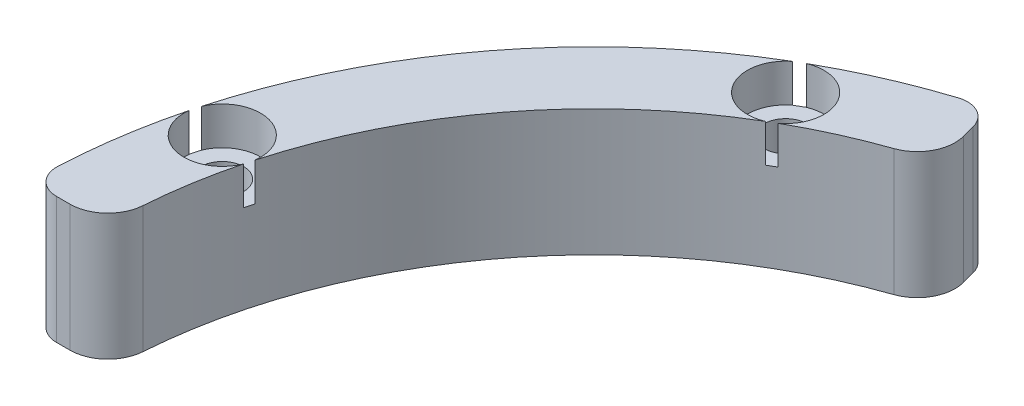
ISO-10303-21;
HEADER;
FILE_DESCRIPTION(('STEP AP214'),'2;1');
FILE_NAME('part.step','',(''),(''),'','','');
FILE_SCHEMA(('AUTOMOTIVE_DESIGN { 1 0 10303 214 1 1 1 1 }'));
ENDSEC;
DATA;
#1=APPLICATION_CONTEXT('core data for automotive mechanical design processes');
#2=APPLICATION_PROTOCOL_DEFINITION('international standard','automotive_design',2000,#1);
#3=PRODUCT_CONTEXT('',#1,'mechanical');
#4=PRODUCT('Part','Part','',(#3));
#5=PRODUCT_RELATED_PRODUCT_CATEGORY('part','',(#4));
#6=PRODUCT_DEFINITION_FORMATION('','',#4);
#7=PRODUCT_DEFINITION_CONTEXT('part definition',#1,'design');
#8=PRODUCT_DEFINITION('design','',#6,#7);
#9=PRODUCT_DEFINITION_SHAPE('','',#8);
#10=(LENGTH_UNIT() NAMED_UNIT(*) SI_UNIT(.MILLI.,.METRE.));
#11=(NAMED_UNIT(*) PLANE_ANGLE_UNIT() SI_UNIT($,.RADIAN.));
#12=(NAMED_UNIT(*) SI_UNIT($,.STERADIAN.) SOLID_ANGLE_UNIT());
#13=UNCERTAINTY_MEASURE_WITH_UNIT(LENGTH_MEASURE(1.E-05),#10,'distance_accuracy_value','');
#14=(GEOMETRIC_REPRESENTATION_CONTEXT(3) GLOBAL_UNCERTAINTY_ASSIGNED_CONTEXT((#13)) GLOBAL_UNIT_ASSIGNED_CONTEXT((#10,
#11,#12)) REPRESENTATION_CONTEXT('',''));
#15=CARTESIAN_POINT('',(0.,0.,0.));
#16=DIRECTION('',(0.,0.,1.));
#17=DIRECTION('',(1.,0.,0.));
#18=AXIS2_PLACEMENT_3D('',#15,#16,#17);
#19=CARTESIAN_POINT('',(-44.5,10.,0.));
#20=DIRECTION('',(0.,1.,0.));
#21=DIRECTION('',(0.,0.,1.));
#22=AXIS2_PLACEMENT_3D('',#19,#20,#21);
#23=PLANE('',#22);
#24=CARTESIAN_POINT('',(-40.0859217909964,10.,-10.7409903717543));
#25=DIRECTION('',(0.,1.,0.));
#26=DIRECTION('',(0.,0.,1.));
#27=AXIS2_PLACEMENT_3D('',#24,#25,#26);
#28=CIRCLE('',#27,3.02500000000001);
#29=CARTESIAN_POINT('',(-37.0896425066327,10.,-10.3251352887112));
#30=VERTEX_POINT('',#29);
#31=CARTESIAN_POINT('',(-42.8779312714496,10.,-11.9051673604718));
#32=VERTEX_POINT('',#31);
#33=EDGE_CURVE('E175',#30,#32,#28,.T.);
#34=ORIENTED_EDGE('',*,*,#33,.F.);
#35=CARTESIAN_POINT('',(0.,10.,0.));
#36=DIRECTION('',(0.,-1.,0.));
#37=DIRECTION('',(0.,0.,-1.));
#38=AXIS2_PLACEMENT_3D('',#35,#36,#37);
#39=CIRCLE('',#38,38.5);
#40=CARTESIAN_POINT('',(-19.5728206920555,10.,-33.1535019290066));
#41=VERTEX_POINT('',#40);
#42=EDGE_CURVE('E164',#30,#41,#39,.T.);
#43=ORIENTED_EDGE('',*,*,#42,.T.);
#44=CARTESIAN_POINT('',(-20.75,10.,-35.9400542570542));
#45=DIRECTION('',(0.,1.,0.));
#46=DIRECTION('',(0.,0.,1.));
#47=AXIS2_PLACEMENT_3D('',#44,#45,#46);
#48=CIRCLE('',#47,3.02500000000001);
#49=CARTESIAN_POINT('',(-22.5971338474218,10.,-38.3356171449177));
#50=VERTEX_POINT('',#49);
#51=EDGE_CURVE('E250',#50,#41,#48,.T.);
#52=ORIENTED_EDGE('',*,*,#51,.F.);
#53=CARTESIAN_POINT('',(0.,10.,0.));
#54=DIRECTION('',(0.,-1.,0.));
#55=DIRECTION('',(0.,0.,-1.));
#56=AXIS2_PLACEMENT_3D('',#53,#54,#55);
#57=CIRCLE('',#56,44.5);
#58=EDGE_CURVE('E251',#32,#50,#57,.T.);
#59=ORIENTED_EDGE('',*,*,#58,.F.);
#60=EDGE_LOOP('',(#34,#43,#52,#59));
#61=FACE_BOUND('',#60,.T.);
#62=ADVANCED_FACE('F37',(#61),#23,.T.);
#63=CARTESIAN_POINT('',(-18.9253645489084,10.,-33.5273109075411));
#64=VERTEX_POINT('',#63);
#65=CARTESIAN_POINT('',(-12.6267627808588,10.,-36.3705218779704));
#66=VERTEX_POINT('',#65);
#67=EDGE_CURVE('E166',#64,#66,#39,.T.);
#68=ORIENTED_EDGE('',*,*,#67,.T.);
#69=CARTESIAN_POINT('',(-13.6106663741724,10.,-39.2045885178122));
#70=DIRECTION('',(0.,1.,0.));
#71=DIRECTION('',(0.,0.,1.));
#72=AXIS2_PLACEMENT_3D('',#69,#70,#71);
#73=CIRCLE('',#72,3.);
#74=CARTESIAN_POINT('',(-10.7128888953052,10.,-39.9810456531198));
#75=VERTEX_POINT('',#74);
#76=EDGE_CURVE('E11',#66,#75,#73,.T.);
#77=ORIENTED_EDGE('',*,*,#76,.T.);
#78=DIRECTION('',(0.258819045102519,0.,0.965925826289069));
#79=VECTOR('',#78,1.);
#80=CARTESIAN_POINT('',(-11.5174475070621,10.,-42.9836992698636));
#81=LINE('',#80,#79);
#82=CARTESIAN_POINT('',(-10.9876229465133,10.,-41.0063670907977));
#83=VERTEX_POINT('',#82);
#84=EDGE_CURVE('E226',#83,#75,#81,.T.);
#85=ORIENTED_EDGE('',*,*,#84,.F.);
#86=CARTESIAN_POINT('',(-12.9194745990915,10.,-40.4887290005926));
#87=DIRECTION('',(0.,1.,0.));
#88=DIRECTION('',(0.,0.,1.));
#89=AXIS2_PLACEMENT_3D('',#86,#87,#88);
#90=CIRCLE('',#89,2.);
#91=CARTESIAN_POINT('',(-13.5274498743428,10.,-42.3940809535617));
#92=VERTEX_POINT('',#91);
#93=EDGE_CURVE('E194',#83,#92,#90,.T.);
#94=ORIENTED_EDGE('',*,*,#93,.T.);
#95=CARTESIAN_POINT('',(-21.9010513935421,10.,-38.7375005370433));
#96=VERTEX_POINT('',#95);
#97=EDGE_CURVE('E163',#96,#92,#57,.T.);
#98=ORIENTED_EDGE('',*,*,#97,.F.);
#99=EDGE_CURVE('E254',#64,#96,#48,.T.);
#100=ORIENTED_EDGE('',*,*,#99,.F.);
#101=EDGE_LOOP('',(#68,#77,#85,#94,#98,#100));
#102=FACE_BOUND('',#101,.T.);
#103=ADVANCED_FACE('F268',(#102),#23,.T.);
#104=CARTESIAN_POINT('',(0.,10.,0.));
#105=DIRECTION('',(0.,-1.,0.));
#106=DIRECTION('',(0.,0.,-1.));
#107=AXIS2_PLACEMENT_3D('',#104,#105,#106);
#108=CYLINDRICAL_SURFACE('',#107,44.5);
#109=ORIENTED_EDGE('',*,*,#97,.T.);
#110=DIRECTION('',(0.,-1.,0.));
#111=VECTOR('',#110,1.);
#112=CARTESIAN_POINT('',(-13.5274498743428,10.,-42.3940809535617));
#113=LINE('',#112,#111);
#114=CARTESIAN_POINT('',(-13.5274498743428,0.,-42.3940809535617));
#115=VERTEX_POINT('',#114);
#116=EDGE_CURVE('E199',#92,#115,#113,.T.);
#117=ORIENTED_EDGE('',*,*,#116,.T.);
#118=CARTESIAN_POINT('',(0.,0.,0.));
#119=DIRECTION('',(0.,-1.,0.));
#120=DIRECTION('',(0.,0.,-1.));
#121=AXIS2_PLACEMENT_3D('',#118,#119,#120);
#122=CIRCLE('',#121,44.5);
#123=CARTESIAN_POINT('',(-44.4506993339844,0.,-2.09411764705877));
#124=VERTEX_POINT('',#123);
#125=EDGE_CURVE('E244',#124,#115,#122,.T.);
#126=ORIENTED_EDGE('',*,*,#125,.F.);
#127=DIRECTION('',(0.,-1.,0.));
#128=VECTOR('',#127,1.);
#129=CARTESIAN_POINT('',(-44.4506993339844,10.,-2.09411764705877));
#130=LINE('',#129,#128);
#131=CARTESIAN_POINT('',(-44.4506993339844,10.,-2.09411764705877));
#132=VERTEX_POINT('',#131);
#133=EDGE_CURVE('E196',#124,#132,#130,.F.);
#134=ORIENTED_EDGE('',*,*,#133,.T.);
#135=CARTESIAN_POINT('',(-43.0859614230346,10.,-11.1287882652503));
#136=VERTEX_POINT('',#135);
#137=EDGE_CURVE('E248',#132,#136,#57,.T.);
#138=ORIENTED_EDGE('',*,*,#137,.T.);
#139=DIRECTION('',(0.,1.,0.));
#140=VECTOR('',#139,1.);
#141=CARTESIAN_POINT('',(-43.0859614230346,8.5,-11.1287882652503));
#142=LINE('',#141,#140);
#143=CARTESIAN_POINT('',(-43.0859614230346,7.,-11.1287882652503));
#144=VERTEX_POINT('',#143);
#145=EDGE_CURVE('E174',#144,#136,#142,.T.);
#146=ORIENTED_EDGE('',*,*,#145,.F.);
#147=CARTESIAN_POINT('',(0.,7.,0.));
#148=DIRECTION('',(0.,-1.,0.));
#149=DIRECTION('',(0.,0.,-1.));
#150=AXIS2_PLACEMENT_3D('',#147,#148,#149);
#151=CIRCLE('',#150,44.5);
#152=CARTESIAN_POINT('',(-42.8779312714496,7.,-11.9051673604718));
#153=VERTEX_POINT('',#152);
#154=EDGE_CURVE('E189',#153,#144,#151,.F.);
#155=ORIENTED_EDGE('',*,*,#154,.F.);
#156=DIRECTION('',(0.,1.,0.));
#157=VECTOR('',#156,1.);
#158=CARTESIAN_POINT('',(-42.8779312714496,8.5,-11.9051673604718));
#159=LINE('',#158,#157);
#160=EDGE_CURVE('E287',#32,#153,#159,.F.);
#161=ORIENTED_EDGE('',*,*,#160,.F.);
#162=ORIENTED_EDGE('',*,*,#58,.T.);
#163=DIRECTION('',(0.,1.,0.));
#164=VECTOR('',#163,1.);
#165=CARTESIAN_POINT('',(-22.5971338474218,8.5,-38.3356171449177));
#166=LINE('',#165,#164);
#167=CARTESIAN_POINT('',(-22.5971338474218,7.,-38.3356171449177));
#168=VERTEX_POINT('',#167);
#169=EDGE_CURVE('E284',#168,#50,#166,.T.);
#170=ORIENTED_EDGE('',*,*,#169,.F.);
#171=CARTESIAN_POINT('',(0.,7.,0.));
#172=DIRECTION('',(0.,-1.,0.));
#173=DIRECTION('',(0.,0.,-1.));
#174=AXIS2_PLACEMENT_3D('',#171,#172,#173);
#175=CIRCLE('',#174,44.5);
#176=CARTESIAN_POINT('',(-21.9010513935421,7.,-38.7375005370433));
#177=VERTEX_POINT('',#176);
#178=EDGE_CURVE('E239',#177,#168,#175,.F.);
#179=ORIENTED_EDGE('',*,*,#178,.F.);
#180=DIRECTION('',(0.,1.,0.));
#181=VECTOR('',#180,1.);
#182=CARTESIAN_POINT('',(-21.9010513935421,8.5,-38.7375005370433));
#183=LINE('',#182,#181);
#184=EDGE_CURVE('E298',#96,#177,#183,.F.);
#185=ORIENTED_EDGE('',*,*,#184,.F.);
#186=EDGE_LOOP('',(#109,#117,#126,#134,#138,#146,#155,#161,#162,#170,#179,#185));
#187=FACE_BOUND('',#186,.T.);
#188=ADVANCED_FACE('F303',(#187),#108,.T.);
#189=DIRECTION('',(1.,0.,0.));
#190=VECTOR('',#189,1.);
#191=CARTESIAN_POINT('',(-44.5,10.,0.));
#192=LINE('',#191,#190);
#193=CARTESIAN_POINT('',(-42.4529150942547,10.,0.));
#194=VERTEX_POINT('',#193);
#195=CARTESIAN_POINT('',(-41.391424232563,10.,0.));
#196=VERTEX_POINT('',#195);
#197=EDGE_CURVE('E235',#194,#196,#192,.T.);
#198=ORIENTED_EDGE('',*,*,#197,.T.);
#199=CARTESIAN_POINT('',(-41.391424232563,10.,-2.99999999999995));
#200=DIRECTION('',(0.,1.,0.));
#201=DIRECTION('',(0.,0.,1.));
#202=AXIS2_PLACEMENT_3D('',#199,#200,#201);
#203=CIRCLE('',#202,3.);
#204=CARTESIAN_POINT('',(-38.3992730832211,10.,-2.78313253012043));
#205=VERTEX_POINT('',#204);
#206=EDGE_CURVE('E158',#196,#205,#203,.T.);
#207=ORIENTED_EDGE('',*,*,#206,.T.);
#208=CARTESIAN_POINT('',(-37.2831402723827,10.,-9.60299179578079));
#209=VERTEX_POINT('',#208);
#210=EDGE_CURVE('E152',#205,#209,#39,.T.);
#211=ORIENTED_EDGE('',*,*,#210,.T.);
#212=EDGE_CURVE('E156',#136,#209,#28,.T.);
#213=ORIENTED_EDGE('',*,*,#212,.F.);
#214=ORIENTED_EDGE('',*,*,#137,.F.);
#215=CARTESIAN_POINT('',(-42.4529150942547,10.,-1.99999999999995));
#216=DIRECTION('',(0.,1.,0.));
#217=DIRECTION('',(0.,0.,1.));
#218=AXIS2_PLACEMENT_3D('',#215,#216,#217);
#219=CIRCLE('',#218,2.);
#220=EDGE_CURVE('E206',#132,#194,#219,.T.);
#221=ORIENTED_EDGE('',*,*,#220,.T.);
#222=EDGE_LOOP('',(#198,#207,#211,#213,#214,#221));
#223=FACE_BOUND('',#222,.T.);
#224=ADVANCED_FACE('F154',(#223),#23,.T.);
#225=CARTESIAN_POINT('',(0.,10.,0.));
#226=DIRECTION('',(0.,-1.,0.));
#227=DIRECTION('',(0.,0.,-1.));
#228=AXIS2_PLACEMENT_3D('',#225,#226,#227);
#229=CYLINDRICAL_SURFACE('',#228,38.5);
#230=ORIENTED_EDGE('',*,*,#210,.F.);
#231=DIRECTION('',(0.,-1.,0.));
#232=VECTOR('',#231,1.);
#233=CARTESIAN_POINT('',(-38.3992730832211,10.,-2.78313253012043));
#234=LINE('',#233,#232);
#235=CARTESIAN_POINT('',(-38.3992730832211,0.,-2.78313253012043));
#236=VERTEX_POINT('',#235);
#237=EDGE_CURVE('E213',#205,#236,#234,.T.);
#238=ORIENTED_EDGE('',*,*,#237,.T.);
#239=CARTESIAN_POINT('',(0.,0.,0.));
#240=DIRECTION('',(0.,-1.,0.));
#241=DIRECTION('',(0.,0.,-1.));
#242=AXIS2_PLACEMENT_3D('',#239,#240,#241);
#243=CIRCLE('',#242,38.5);
#244=CARTESIAN_POINT('',(-12.6267627808587,0.,-36.3705218779704));
#245=VERTEX_POINT('',#244);
#246=EDGE_CURVE('E246',#236,#245,#243,.T.);
#247=ORIENTED_EDGE('',*,*,#246,.T.);
#248=DIRECTION('',(0.,-1.,0.));
#249=VECTOR('',#248,1.);
#250=CARTESIAN_POINT('',(-12.6267627808588,10.,-36.3705218779704));
#251=LINE('',#250,#249);
#252=EDGE_CURVE('E211',#245,#66,#251,.F.);
#253=ORIENTED_EDGE('',*,*,#252,.T.);
#254=ORIENTED_EDGE('',*,*,#67,.F.);
#255=DIRECTION('',(0.,1.,0.));
#256=VECTOR('',#255,1.);
#257=CARTESIAN_POINT('',(-18.9253645489088,8.5,-33.5273109075408));
#258=LINE('',#257,#256);
#259=CARTESIAN_POINT('',(-18.9253645489084,7.,-33.527310907541));
#260=VERTEX_POINT('',#259);
#261=EDGE_CURVE('E176',#260,#64,#258,.T.);
#262=ORIENTED_EDGE('',*,*,#261,.F.);
#263=CARTESIAN_POINT('',(0.,7.,0.));
#264=DIRECTION('',(0.,-1.,0.));
#265=DIRECTION('',(0.,0.,-1.));
#266=AXIS2_PLACEMENT_3D('',#263,#264,#265);
#267=CIRCLE('',#266,38.5);
#268=CARTESIAN_POINT('',(-19.572820692055,7.,-33.1535019290068));
#269=VERTEX_POINT('',#268);
#270=EDGE_CURVE('E253',#269,#260,#267,.T.);
#271=ORIENTED_EDGE('',*,*,#270,.F.);
#272=DIRECTION('',(0.,1.,0.));
#273=VECTOR('',#272,1.);
#274=CARTESIAN_POINT('',(-19.572820692055,8.5,-33.1535019290068));
#275=LINE('',#274,#273);
#276=EDGE_CURVE('E252',#41,#269,#275,.F.);
#277=ORIENTED_EDGE('',*,*,#276,.F.);
#278=ORIENTED_EDGE('',*,*,#42,.F.);
#279=DIRECTION('',(0.,1.,0.));
#280=VECTOR('',#279,1.);
#281=CARTESIAN_POINT('',(-37.0896425066327,8.5,-10.3251352887106));
#282=LINE('',#281,#280);
#283=CARTESIAN_POINT('',(-37.0896425066327,7.,-10.3251352887106));
#284=VERTEX_POINT('',#283);
#285=EDGE_CURVE('E183',#284,#30,#282,.T.);
#286=ORIENTED_EDGE('',*,*,#285,.F.);
#287=CARTESIAN_POINT('',(0.,7.,0.));
#288=DIRECTION('',(0.,-1.,0.));
#289=DIRECTION('',(0.,0.,-1.));
#290=AXIS2_PLACEMENT_3D('',#287,#288,#289);
#291=CIRCLE('',#290,38.5);
#292=CARTESIAN_POINT('',(-37.2831402723825,7.,-9.60299179578131));
#293=VERTEX_POINT('',#292);
#294=EDGE_CURVE('E181',#293,#284,#291,.T.);
#295=ORIENTED_EDGE('',*,*,#294,.F.);
#296=DIRECTION('',(0.,1.,0.));
#297=VECTOR('',#296,1.);
#298=CARTESIAN_POINT('',(-37.2831402723825,8.5,-9.60299179578132));
#299=LINE('',#298,#297);
#300=EDGE_CURVE('E171',#209,#293,#299,.F.);
#301=ORIENTED_EDGE('',*,*,#300,.F.);
#302=EDGE_LOOP('',(#230,#238,#247,#253,#254,#262,#271,#277,#278,#286,#295,#301));
#303=FACE_BOUND('',#302,.T.);
#304=ADVANCED_FACE('F179',(#303),#229,.F.);
#305=CARTESIAN_POINT('',(-38.5,0.,0.));
#306=DIRECTION('',(0.,-1.,0.));
#307=DIRECTION('',(0.,0.,-1.));
#308=AXIS2_PLACEMENT_3D('',#305,#306,#307);
#309=PLANE('',#308);
#310=CARTESIAN_POINT('',(-40.0859217909964,0.,-10.7409903717543));
#311=DIRECTION('',(0.,1.,0.));
#312=DIRECTION('',(0.,0.,1.));
#313=AXIS2_PLACEMENT_3D('',#310,#311,#312);
#314=CIRCLE('',#313,1.70000000000001);
#315=CARTESIAN_POINT('',(-40.0859217909964,0.,-9.04099037175433));
#316=VERTEX_POINT('',#315);
#317=EDGE_CURVE('E349',#316,#316,#314,.T.);
#318=ORIENTED_EDGE('',*,*,#317,.T.);
#319=EDGE_LOOP('',(#318));
#320=FACE_BOUND('',#319,.T.);
#321=CARTESIAN_POINT('',(-20.75,0.,-35.9400542570542));
#322=DIRECTION('',(0.,1.,0.));
#323=DIRECTION('',(0.,0.,1.));
#324=AXIS2_PLACEMENT_3D('',#321,#322,#323);
#325=CIRCLE('',#324,1.70000000000001);
#326=CARTESIAN_POINT('',(-20.75,0.,-34.2400542570542));
#327=VERTEX_POINT('',#326);
#328=EDGE_CURVE('E294',#327,#327,#325,.T.);
#329=ORIENTED_EDGE('',*,*,#328,.T.);
#330=EDGE_LOOP('',(#329));
#331=FACE_BOUND('',#330,.T.);
#332=ORIENTED_EDGE('',*,*,#246,.F.);
#333=CARTESIAN_POINT('',(-41.391424232563,0.,-2.99999999999995));
#334=DIRECTION('',(0.,-1.,0.));
#335=DIRECTION('',(0.,0.,-1.));
#336=AXIS2_PLACEMENT_3D('',#333,#334,#335);
#337=CIRCLE('',#336,3.);
#338=CARTESIAN_POINT('',(-41.391424232563,0.,0.));
#339=VERTEX_POINT('',#338);
#340=EDGE_CURVE('E217',#236,#339,#337,.T.);
#341=ORIENTED_EDGE('',*,*,#340,.T.);
#342=DIRECTION('',(-1.,0.,0.));
#343=VECTOR('',#342,1.);
#344=CARTESIAN_POINT('',(-38.5,0.,0.));
#345=LINE('',#344,#343);
#346=CARTESIAN_POINT('',(-42.4529150942547,0.,0.));
#347=VERTEX_POINT('',#346);
#348=EDGE_CURVE('E237',#339,#347,#345,.T.);
#349=ORIENTED_EDGE('',*,*,#348,.T.);
#350=CARTESIAN_POINT('',(-42.4529150942547,0.,-1.99999999999995));
#351=DIRECTION('',(0.,-1.,0.));
#352=DIRECTION('',(0.,0.,-1.));
#353=AXIS2_PLACEMENT_3D('',#350,#351,#352);
#354=CIRCLE('',#353,2.);
#355=EDGE_CURVE('E201',#347,#124,#354,.T.);
#356=ORIENTED_EDGE('',*,*,#355,.T.);
#357=ORIENTED_EDGE('',*,*,#125,.T.);
#358=CARTESIAN_POINT('',(-12.9194745990915,0.,-40.4887290005926));
#359=DIRECTION('',(0.,-1.,0.));
#360=DIRECTION('',(0.,0.,-1.));
#361=AXIS2_PLACEMENT_3D('',#358,#359,#360);
#362=CIRCLE('',#361,2.);
#363=CARTESIAN_POINT('',(-10.9876229465133,0.,-41.0063670907977));
#364=VERTEX_POINT('',#363);
#365=EDGE_CURVE('E203',#115,#364,#362,.T.);
#366=ORIENTED_EDGE('',*,*,#365,.T.);
#367=DIRECTION('',(-0.258819045102519,0.,-0.965925826289069));
#368=VECTOR('',#367,1.);
#369=CARTESIAN_POINT('',(-9.96453323644698,0.,-37.1881443121292));
#370=LINE('',#369,#368);
#371=CARTESIAN_POINT('',(-10.7128888953052,0.,-39.9810456531198));
#372=VERTEX_POINT('',#371);
#373=EDGE_CURVE('E225',#372,#364,#370,.T.);
#374=ORIENTED_EDGE('',*,*,#373,.F.);
#375=CARTESIAN_POINT('',(-13.6106663741724,0.,-39.2045885178122));
#376=DIRECTION('',(0.,-1.,0.));
#377=DIRECTION('',(0.,0.,-1.));
#378=AXIS2_PLACEMENT_3D('',#375,#376,#377);
#379=CIRCLE('',#378,3.);
#380=EDGE_CURVE('E215',#372,#245,#379,.T.);
#381=ORIENTED_EDGE('',*,*,#380,.T.);
#382=EDGE_LOOP('',(#332,#341,#349,#356,#357,#366,#374,#381));
#383=FACE_BOUND('',#382,.T.);
#384=ADVANCED_FACE('F230',(#320,#331,#383),#309,.T.);
#385=CARTESIAN_POINT('',(0.,0.,0.));
#386=DIRECTION('',(0.,0.,-1.));
#387=DIRECTION('',(-1.,0.,0.));
#388=AXIS2_PLACEMENT_3D('',#385,#386,#387);
#389=PLANE('',#388);
#390=ORIENTED_EDGE('',*,*,#348,.F.);
#391=DIRECTION('',(0.,1.,0.));
#392=VECTOR('',#391,1.);
#393=CARTESIAN_POINT('',(-41.391424232563,10.,0.));
#394=LINE('',#393,#392);
#395=EDGE_CURVE('E58',#339,#196,#394,.T.);
#396=ORIENTED_EDGE('',*,*,#395,.T.);
#397=ORIENTED_EDGE('',*,*,#197,.F.);
#398=DIRECTION('',(0.,1.,0.));
#399=VECTOR('',#398,1.);
#400=CARTESIAN_POINT('',(-42.4529150942547,0.,0.));
#401=LINE('',#400,#399);
#402=EDGE_CURVE('E208',#194,#347,#401,.F.);
#403=ORIENTED_EDGE('',*,*,#402,.T.);
#404=EDGE_LOOP('',(#390,#396,#397,#403));
#405=FACE_BOUND('',#404,.T.);
#406=ADVANCED_FACE('F339',(#405),#389,.F.);
#407=CARTESIAN_POINT('',(0.,0.,0.));
#408=DIRECTION('',(0.965925826289069,0.,-0.258819045102519));
#409=DIRECTION('',(-0.258819045102519,0.,-0.965925826289069));
#410=AXIS2_PLACEMENT_3D('',#407,#408,#409);
#411=PLANE('',#410);
#412=ORIENTED_EDGE('',*,*,#84,.T.);
#413=DIRECTION('',(0.,-1.,0.));
#414=VECTOR('',#413,1.);
#415=CARTESIAN_POINT('',(-10.7128888953052,0.,-39.9810456531198));
#416=LINE('',#415,#414);
#417=EDGE_CURVE('E45',#75,#372,#416,.T.);
#418=ORIENTED_EDGE('',*,*,#417,.T.);
#419=ORIENTED_EDGE('',*,*,#373,.T.);
#420=DIRECTION('',(0.,-1.,0.));
#421=VECTOR('',#420,1.);
#422=CARTESIAN_POINT('',(-10.9876229465133,0.,-41.0063670907977));
#423=LINE('',#422,#421);
#424=EDGE_CURVE('E191',#364,#83,#423,.F.);
#425=ORIENTED_EDGE('',*,*,#424,.T.);
#426=EDGE_LOOP('',(#412,#418,#419,#425));
#427=FACE_BOUND('',#426,.T.);
#428=ADVANCED_FACE('F224',(#427),#411,.T.);
#429=CARTESIAN_POINT('',(-20.75,10.,-35.9400542570542));
#430=DIRECTION('',(0.,1.,0.));
#431=DIRECTION('',(0.,0.,1.));
#432=AXIS2_PLACEMENT_3D('',#429,#430,#431);
#433=CYLINDRICAL_SURFACE('',#432,3.02500000000001);
#434=ORIENTED_EDGE('',*,*,#184,.T.);
#435=CARTESIAN_POINT('',(-20.75,7.,-35.9400542570542));
#436=DIRECTION('',(0.,1.,0.));
#437=DIRECTION('',(0.,0.,1.));
#438=AXIS2_PLACEMENT_3D('',#435,#436,#437);
#439=CIRCLE('',#438,3.02500000000001);
#440=EDGE_CURVE('E265',#260,#177,#439,.T.);
#441=ORIENTED_EDGE('',*,*,#440,.F.);
#442=ORIENTED_EDGE('',*,*,#261,.T.);
#443=ORIENTED_EDGE('',*,*,#99,.T.);
#444=EDGE_LOOP('',(#434,#441,#442,#443));
#445=FACE_BOUND('',#444,.T.);
#446=ADVANCED_FACE('F263',(#445),#433,.F.);
#447=CARTESIAN_POINT('',(-20.75,10.,-35.9400542570542));
#448=DIRECTION('',(0.,1.,0.));
#449=DIRECTION('',(0.,0.,1.));
#450=AXIS2_PLACEMENT_3D('',#447,#448,#449);
#451=CYLINDRICAL_SURFACE('',#450,1.70000000000001);
#452=ORIENTED_EDGE('',*,*,#328,.F.);
#453=EDGE_LOOP('',(#452));
#454=FACE_BOUND('',#453,.T.);
#455=CARTESIAN_POINT('',(-20.75,7.,-35.9400542570542));
#456=DIRECTION('',(0.,1.,0.));
#457=DIRECTION('',(0.,0.,1.));
#458=AXIS2_PLACEMENT_3D('',#455,#456,#457);
#459=CIRCLE('',#458,1.70000000000001);
#460=CARTESIAN_POINT('',(-20.75,7.,-34.2400542570542));
#461=VERTEX_POINT('',#460);
#462=EDGE_CURVE('E291',#461,#461,#459,.T.);
#463=ORIENTED_EDGE('',*,*,#462,.T.);
#464=EDGE_LOOP('',(#463));
#465=FACE_BOUND('',#464,.T.);
#466=ADVANCED_FACE('F352',(#454,#465),#451,.F.);
#467=CARTESIAN_POINT('',(-19.05,7.,-35.9400542570542));
#468=DIRECTION('',(0.,-1.,0.));
#469=DIRECTION('',(0.,0.,-1.));
#470=AXIS2_PLACEMENT_3D('',#467,#468,#469);
#471=PLANE('',#470);
#472=ORIENTED_EDGE('',*,*,#178,.T.);
#473=EDGE_CURVE('E289',#168,#269,#439,.T.);
#474=ORIENTED_EDGE('',*,*,#473,.T.);
#475=ORIENTED_EDGE('',*,*,#270,.T.);
#476=ORIENTED_EDGE('',*,*,#440,.T.);
#477=EDGE_LOOP('',(#472,#474,#475,#476));
#478=FACE_BOUND('',#477,.T.);
#479=ORIENTED_EDGE('',*,*,#462,.F.);
#480=EDGE_LOOP('',(#479));
#481=FACE_BOUND('',#480,.T.);
#482=ADVANCED_FACE('F300',(#478,#481),#471,.F.);
#483=ORIENTED_EDGE('',*,*,#169,.T.);
#484=ORIENTED_EDGE('',*,*,#51,.T.);
#485=ORIENTED_EDGE('',*,*,#276,.T.);
#486=ORIENTED_EDGE('',*,*,#473,.F.);
#487=EDGE_LOOP('',(#483,#484,#485,#486));
#488=FACE_BOUND('',#487,.T.);
#489=ADVANCED_FACE('F281',(#488),#433,.F.);
#490=CARTESIAN_POINT('',(-40.0859217909964,10.,-10.7409903717543));
#491=DIRECTION('',(0.,1.,0.));
#492=DIRECTION('',(0.,0.,1.));
#493=AXIS2_PLACEMENT_3D('',#490,#491,#492);
#494=CYLINDRICAL_SURFACE('',#493,3.02500000000001);
#495=ORIENTED_EDGE('',*,*,#160,.T.);
#496=CARTESIAN_POINT('',(-40.0859217909964,7.,-10.7409903717543));
#497=DIRECTION('',(0.,1.,0.));
#498=DIRECTION('',(0.,0.,1.));
#499=AXIS2_PLACEMENT_3D('',#496,#497,#498);
#500=CIRCLE('',#499,3.02500000000001);
#501=EDGE_CURVE('E527',#284,#153,#500,.T.);
#502=ORIENTED_EDGE('',*,*,#501,.F.);
#503=ORIENTED_EDGE('',*,*,#285,.T.);
#504=ORIENTED_EDGE('',*,*,#33,.T.);
#505=EDGE_LOOP('',(#495,#502,#503,#504));
#506=FACE_BOUND('',#505,.T.);
#507=ADVANCED_FACE('F322',(#506),#494,.F.);
#508=CARTESIAN_POINT('',(-40.0859217909964,10.,-10.7409903717543));
#509=DIRECTION('',(0.,1.,0.));
#510=DIRECTION('',(0.,0.,1.));
#511=AXIS2_PLACEMENT_3D('',#508,#509,#510);
#512=CYLINDRICAL_SURFACE('',#511,1.70000000000001);
#513=ORIENTED_EDGE('',*,*,#317,.F.);
#514=EDGE_LOOP('',(#513));
#515=FACE_BOUND('',#514,.T.);
#516=CARTESIAN_POINT('',(-40.0859217909964,7.,-10.7409903717543));
#517=DIRECTION('',(0.,1.,0.));
#518=DIRECTION('',(0.,0.,1.));
#519=AXIS2_PLACEMENT_3D('',#516,#517,#518);
#520=CIRCLE('',#519,1.70000000000001);
#521=CARTESIAN_POINT('',(-40.0859217909964,7.,-9.04099037175433));
#522=VERTEX_POINT('',#521);
#523=EDGE_CURVE('E522',#522,#522,#520,.T.);
#524=ORIENTED_EDGE('',*,*,#523,.T.);
#525=EDGE_LOOP('',(#524));
#526=FACE_BOUND('',#525,.T.);
#527=ADVANCED_FACE('F396',(#515,#526),#512,.F.);
#528=CARTESIAN_POINT('',(-38.3859217909964,7.,-10.7409903717543));
#529=DIRECTION('',(0.,-1.,0.));
#530=DIRECTION('',(0.,0.,-1.));
#531=AXIS2_PLACEMENT_3D('',#528,#529,#530);
#532=PLANE('',#531);
#533=ORIENTED_EDGE('',*,*,#154,.T.);
#534=EDGE_CURVE('E528',#144,#293,#500,.T.);
#535=ORIENTED_EDGE('',*,*,#534,.T.);
#536=ORIENTED_EDGE('',*,*,#294,.T.);
#537=ORIENTED_EDGE('',*,*,#501,.T.);
#538=EDGE_LOOP('',(#533,#535,#536,#537));
#539=FACE_BOUND('',#538,.T.);
#540=ORIENTED_EDGE('',*,*,#523,.F.);
#541=EDGE_LOOP('',(#540));
#542=FACE_BOUND('',#541,.T.);
#543=ADVANCED_FACE('F320',(#539,#542),#532,.F.);
#544=ORIENTED_EDGE('',*,*,#145,.T.);
#545=ORIENTED_EDGE('',*,*,#212,.T.);
#546=ORIENTED_EDGE('',*,*,#300,.T.);
#547=ORIENTED_EDGE('',*,*,#534,.F.);
#548=EDGE_LOOP('',(#544,#545,#546,#547));
#549=FACE_BOUND('',#548,.T.);
#550=ADVANCED_FACE('F169',(#549),#494,.F.);
#551=CARTESIAN_POINT('',(-12.9194745990915,10.,-40.4887290005926));
#552=DIRECTION('',(0.,-1.,0.));
#553=DIRECTION('',(0.,0.,-1.));
#554=AXIS2_PLACEMENT_3D('',#551,#552,#553);
#555=CYLINDRICAL_SURFACE('',#554,2.);
#556=ORIENTED_EDGE('',*,*,#365,.F.);
#557=ORIENTED_EDGE('',*,*,#116,.F.);
#558=ORIENTED_EDGE('',*,*,#93,.F.);
#559=ORIENTED_EDGE('',*,*,#424,.F.);
#560=EDGE_LOOP('',(#556,#557,#558,#559));
#561=FACE_BOUND('',#560,.T.);
#562=ADVANCED_FACE('F309',(#561),#555,.T.);
#563=CARTESIAN_POINT('',(-42.4529150942547,10.,-1.99999999999995));
#564=DIRECTION('',(0.,-1.,0.));
#565=DIRECTION('',(0.,0.,-1.));
#566=AXIS2_PLACEMENT_3D('',#563,#564,#565);
#567=CYLINDRICAL_SURFACE('',#566,2.);
#568=ORIENTED_EDGE('',*,*,#355,.F.);
#569=ORIENTED_EDGE('',*,*,#402,.F.);
#570=ORIENTED_EDGE('',*,*,#220,.F.);
#571=ORIENTED_EDGE('',*,*,#133,.F.);
#572=EDGE_LOOP('',(#568,#569,#570,#571));
#573=FACE_BOUND('',#572,.T.);
#574=ADVANCED_FACE('F311',(#573),#567,.T.);
#575=CARTESIAN_POINT('',(-41.391424232563,10.,-2.99999999999995));
#576=DIRECTION('',(0.,-1.,0.));
#577=DIRECTION('',(0.,0.,-1.));
#578=AXIS2_PLACEMENT_3D('',#575,#576,#577);
#579=CYLINDRICAL_SURFACE('',#578,3.);
#580=ORIENTED_EDGE('',*,*,#206,.F.);
#581=ORIENTED_EDGE('',*,*,#395,.F.);
#582=ORIENTED_EDGE('',*,*,#340,.F.);
#583=ORIENTED_EDGE('',*,*,#237,.F.);
#584=EDGE_LOOP('',(#580,#581,#582,#583));
#585=FACE_BOUND('',#584,.T.);
#586=ADVANCED_FACE('F317',(#585),#579,.T.);
#587=CARTESIAN_POINT('',(-13.6106663741724,10.,-39.2045885178122));
#588=DIRECTION('',(0.,-1.,0.));
#589=DIRECTION('',(0.,0.,-1.));
#590=AXIS2_PLACEMENT_3D('',#587,#588,#589);
#591=CYLINDRICAL_SURFACE('',#590,3.);
#592=ORIENTED_EDGE('',*,*,#76,.F.);
#593=ORIENTED_EDGE('',*,*,#252,.F.);
#594=ORIENTED_EDGE('',*,*,#380,.F.);
#595=ORIENTED_EDGE('',*,*,#417,.F.);
#596=EDGE_LOOP('',(#592,#593,#594,#595));
#597=FACE_BOUND('',#596,.T.);
#598=ADVANCED_FACE('F39',(#597),#591,.T.);
#599=CLOSED_SHELL('',(#62,#103,#188,#224,#304,#384,#406,#428,#446,#466,#482,#489,#507,#527,#543,
#550,#562,#574,#586,#598));
#600=MANIFOLD_SOLID_BREP('B2',#599);
#601=ADVANCED_BREP_SHAPE_REPRESENTATION('',(#18,#600),#14);
#602=SHAPE_DEFINITION_REPRESENTATION(#9,#601);
ENDSEC;
END-ISO-10303-21;
